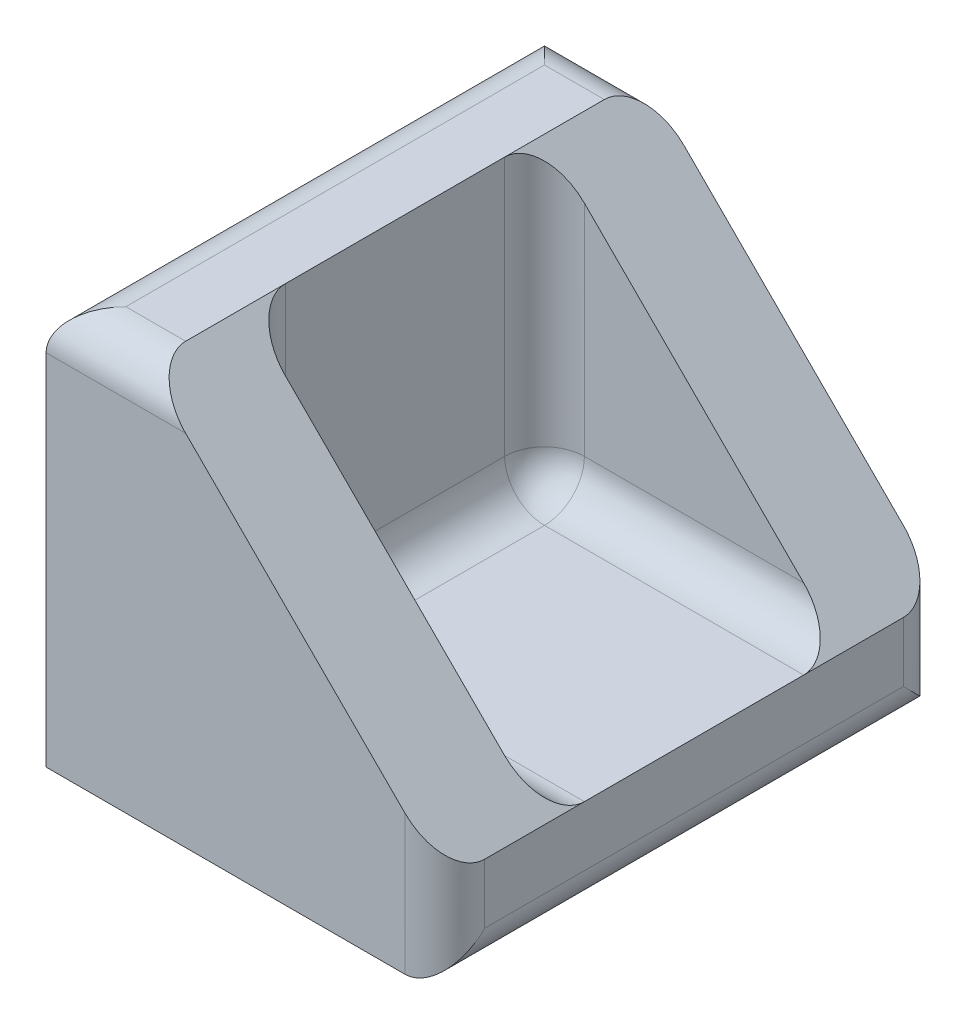
ISO-10303-21;
HEADER;
FILE_DESCRIPTION(('STEP AP214'),'2;1');
FILE_NAME('part.step','',(''),(''),'','','');
FILE_SCHEMA(('AUTOMOTIVE_DESIGN { 1 0 10303 214 1 1 1 1 }'));
ENDSEC;
DATA;
#1=APPLICATION_CONTEXT('core data for automotive mechanical design processes');
#2=APPLICATION_PROTOCOL_DEFINITION('international standard','automotive_design',2000,#1);
#3=PRODUCT_CONTEXT('',#1,'mechanical');
#4=PRODUCT('Part','Part','',(#3));
#5=PRODUCT_RELATED_PRODUCT_CATEGORY('part','',(#4));
#6=PRODUCT_DEFINITION_FORMATION('','',#4);
#7=PRODUCT_DEFINITION_CONTEXT('part definition',#1,'design');
#8=PRODUCT_DEFINITION('design','',#6,#7);
#9=PRODUCT_DEFINITION_SHAPE('','',#8);
#10=(LENGTH_UNIT() NAMED_UNIT(*) SI_UNIT(.MILLI.,.METRE.));
#11=(NAMED_UNIT(*) PLANE_ANGLE_UNIT() SI_UNIT($,.RADIAN.));
#12=(NAMED_UNIT(*) SI_UNIT($,.STERADIAN.) SOLID_ANGLE_UNIT());
#13=UNCERTAINTY_MEASURE_WITH_UNIT(LENGTH_MEASURE(1.E-05),#10,'distance_accuracy_value','');
#14=(GEOMETRIC_REPRESENTATION_CONTEXT(3) GLOBAL_UNCERTAINTY_ASSIGNED_CONTEXT((#13)) GLOBAL_UNIT_ASSIGNED_CONTEXT((#10,
#11,#12)) REPRESENTATION_CONTEXT('',''));
#15=CARTESIAN_POINT('',(0.,0.,0.));
#16=DIRECTION('',(0.,0.,1.));
#17=DIRECTION('',(1.,0.,0.));
#18=AXIS2_PLACEMENT_3D('',#15,#16,#17);
#19=CARTESIAN_POINT('',(5.,20.,-25.));
#20=DIRECTION('',(0.707106781186547,0.707106781186547,0.));
#21=DIRECTION('',(-0.707106781186548,0.707106781186548,0.));
#22=AXIS2_PLACEMENT_3D('',#19,#20,#21);
#23=PLANE('',#22);
#24=DIRECTION('',(-0.707106781186547,0.707106781186547,0.));
#25=VECTOR('',#24,1.);
#26=CARTESIAN_POINT('',(5.,20.,0.));
#27=LINE('',#26,#25);
#28=CARTESIAN_POINT('',(18.,7.,0.));
#29=VERTEX_POINT('',#28);
#30=CARTESIAN_POINT('',(7.,18.,0.));
#31=VERTEX_POINT('',#30);
#32=EDGE_CURVE('E184',#29,#31,#27,.T.);
#33=ORIENTED_EDGE('',*,*,#32,.F.);
#34=CARTESIAN_POINT('',(18.,7.,-2.));
#35=DIRECTION('',(0.707106781186547,0.707106781186547,0.));
#36=DIRECTION('',(0.707106781186548,-0.707106781186548,0.));
#37=AXIS2_PLACEMENT_3D('',#34,#35,#36);
#38=ELLIPSE('',#37,2.82842712474619,2.);
#39=CARTESIAN_POINT('',(20.,5.,-2.));
#40=VERTEX_POINT('',#39);
#41=EDGE_CURVE('E271',#29,#40,#38,.T.);
#42=ORIENTED_EDGE('',*,*,#41,.T.);
#43=DIRECTION('',(0.,0.,1.));
#44=VECTOR('',#43,1.);
#45=CARTESIAN_POINT('',(20.,5.,-25.));
#46=LINE('',#45,#44);
#47=CARTESIAN_POINT('',(20.,5.,-7.));
#48=VERTEX_POINT('',#47);
#49=EDGE_CURVE('E165',#48,#40,#46,.T.);
#50=ORIENTED_EDGE('',*,*,#49,.F.);
#51=CARTESIAN_POINT('',(18.,7.,-7.));
#52=DIRECTION('',(0.707106781186547,0.707106781186547,0.));
#53=DIRECTION('',(0.707106781186548,-0.707106781186548,0.));
#54=AXIS2_PLACEMENT_3D('',#51,#52,#53);
#55=ELLIPSE('',#54,2.82842712474619,2.);
#56=CARTESIAN_POINT('',(18.,7.,-5.));
#57=VERTEX_POINT('',#56);
#58=EDGE_CURVE('E226',#48,#57,#55,.F.);
#59=ORIENTED_EDGE('',*,*,#58,.T.);
#60=DIRECTION('',(-0.707106781186548,0.707106781186548,0.));
#61=VECTOR('',#60,1.);
#62=CARTESIAN_POINT('',(5.,20.,-5.));
#63=LINE('',#62,#61);
#64=CARTESIAN_POINT('',(7.,18.,-5.));
#65=VERTEX_POINT('',#64);
#66=EDGE_CURVE('E189',#57,#65,#63,.T.);
#67=ORIENTED_EDGE('',*,*,#66,.T.);
#68=CARTESIAN_POINT('',(7.,18.,-7.));
#69=DIRECTION('',(0.707106781186547,0.707106781186547,0.));
#70=DIRECTION('',(0.707106781186548,-0.707106781186548,0.));
#71=AXIS2_PLACEMENT_3D('',#68,#69,#70);
#72=ELLIPSE('',#71,2.82842712474619,2.);
#73=CARTESIAN_POINT('',(5.,20.,-7.));
#74=VERTEX_POINT('',#73);
#75=EDGE_CURVE('E221',#65,#74,#72,.F.);
#76=ORIENTED_EDGE('',*,*,#75,.T.);
#77=DIRECTION('',(0.,0.,1.));
#78=VECTOR('',#77,1.);
#79=CARTESIAN_POINT('',(5.,20.,-25.));
#80=LINE('',#79,#78);
#81=CARTESIAN_POINT('',(5.,20.,-2.));
#82=VERTEX_POINT('',#81);
#83=EDGE_CURVE('E193',#74,#82,#80,.T.);
#84=ORIENTED_EDGE('',*,*,#83,.T.);
#85=CARTESIAN_POINT('',(7.,18.,-2.));
#86=DIRECTION('',(0.707106781186547,0.707106781186547,0.));
#87=DIRECTION('',(0.707106781186548,-0.707106781186548,0.));
#88=AXIS2_PLACEMENT_3D('',#85,#86,#87);
#89=ELLIPSE('',#88,2.82842712474619,2.);
#90=EDGE_CURVE('E61',#82,#31,#89,.T.);
#91=ORIENTED_EDGE('',*,*,#90,.T.);
#92=EDGE_LOOP('',(#33,#42,#50,#59,#67,#76,#84,#91));
#93=FACE_BOUND('',#92,.T.);
#94=ADVANCED_FACE('F39',(#93),#23,.T.);
#95=CARTESIAN_POINT('',(20.,0.,-25.));
#96=DIRECTION('',(0.,-1.,0.));
#97=DIRECTION('',(0.,0.,-1.));
#98=AXIS2_PLACEMENT_3D('',#95,#96,#97);
#99=PLANE('',#98);
#100=DIRECTION('',(1.,0.,0.));
#101=VECTOR('',#100,1.);
#102=CARTESIAN_POINT('',(20.,0.,-25.));
#103=LINE('',#102,#101);
#104=CARTESIAN_POINT('',(0.,0.,-25.));
#105=VERTEX_POINT('',#104);
#106=CARTESIAN_POINT('',(18.,0.,-25.));
#107=VERTEX_POINT('',#106);
#108=EDGE_CURVE('E167',#105,#107,#103,.T.);
#109=ORIENTED_EDGE('',*,*,#108,.T.);
#110=DIRECTION('',(0.,0.,1.));
#111=VECTOR('',#110,1.);
#112=CARTESIAN_POINT('',(18.,0.,-25.));
#113=LINE('',#112,#111);
#114=CARTESIAN_POINT('',(18.,0.,0.));
#115=VERTEX_POINT('',#114);
#116=EDGE_CURVE('E48',#107,#115,#113,.T.);
#117=ORIENTED_EDGE('',*,*,#116,.T.);
#118=DIRECTION('',(1.,0.,0.));
#119=VECTOR('',#118,1.);
#120=CARTESIAN_POINT('',(20.,0.,0.));
#121=LINE('',#120,#119);
#122=CARTESIAN_POINT('',(0.,0.,0.));
#123=VERTEX_POINT('',#122);
#124=EDGE_CURVE('E173',#123,#115,#121,.T.);
#125=ORIENTED_EDGE('',*,*,#124,.F.);
#126=DIRECTION('',(0.,0.,1.));
#127=VECTOR('',#126,1.);
#128=CARTESIAN_POINT('',(0.,0.,-25.));
#129=LINE('',#128,#127);
#130=EDGE_CURVE('E158',#105,#123,#129,.T.);
#131=ORIENTED_EDGE('',*,*,#130,.F.);
#132=EDGE_LOOP('',(#109,#117,#125,#131));
#133=FACE_BOUND('',#132,.T.);
#134=ADVANCED_FACE('F169',(#133),#99,.T.);
#135=CARTESIAN_POINT('',(0.,0.,-25.));
#136=DIRECTION('',(-1.,0.,0.));
#137=DIRECTION('',(0.,0.,1.));
#138=AXIS2_PLACEMENT_3D('',#135,#136,#137);
#139=PLANE('',#138);
#140=DIRECTION('',(0.,-1.,0.));
#141=VECTOR('',#140,1.);
#142=CARTESIAN_POINT('',(0.,0.,0.));
#143=LINE('',#142,#141);
#144=CARTESIAN_POINT('',(0.,18.,0.));
#145=VERTEX_POINT('',#144);
#146=EDGE_CURVE('E181',#145,#123,#143,.T.);
#147=ORIENTED_EDGE('',*,*,#146,.F.);
#148=DIRECTION('',(0.,0.,1.));
#149=VECTOR('',#148,1.);
#150=CARTESIAN_POINT('',(0.,18.,-25.));
#151=LINE('',#150,#149);
#152=CARTESIAN_POINT('',(0.,18.,-25.));
#153=VERTEX_POINT('',#152);
#154=EDGE_CURVE('E11',#145,#153,#151,.F.);
#155=ORIENTED_EDGE('',*,*,#154,.T.);
#156=DIRECTION('',(0.,-1.,0.));
#157=VECTOR('',#156,1.);
#158=CARTESIAN_POINT('',(0.,0.,-25.));
#159=LINE('',#158,#157);
#160=EDGE_CURVE('E151',#153,#105,#159,.T.);
#161=ORIENTED_EDGE('',*,*,#160,.T.);
#162=ORIENTED_EDGE('',*,*,#130,.T.);
#163=EDGE_LOOP('',(#147,#155,#161,#162));
#164=FACE_BOUND('',#163,.T.);
#165=ADVANCED_FACE('F160',(#164),#139,.T.);
#166=CARTESIAN_POINT('',(0.,20.,-25.));
#167=DIRECTION('',(0.,1.,0.));
#168=DIRECTION('',(0.,0.,1.));
#169=AXIS2_PLACEMENT_3D('',#166,#167,#168);
#170=PLANE('',#169);
#171=CARTESIAN_POINT('',(5.,20.,-23.));
#172=VERTEX_POINT('',#171);
#173=CARTESIAN_POINT('',(5.,20.,-18.));
#174=VERTEX_POINT('',#173);
#175=EDGE_CURVE('E174',#172,#174,#80,.T.);
#176=ORIENTED_EDGE('',*,*,#175,.F.);
#177=DIRECTION('',(-1.,0.,0.));
#178=VECTOR('',#177,1.);
#179=CARTESIAN_POINT('',(0.,20.,-23.));
#180=LINE('',#179,#178);
#181=CARTESIAN_POINT('',(2.,20.,-23.));
#182=VERTEX_POINT('',#181);
#183=EDGE_CURVE('E255',#172,#182,#180,.T.);
#184=ORIENTED_EDGE('',*,*,#183,.T.);
#185=DIRECTION('',(0.,0.,1.));
#186=VECTOR('',#185,1.);
#187=CARTESIAN_POINT('',(2.,20.,-25.));
#188=LINE('',#187,#186);
#189=CARTESIAN_POINT('',(2.,20.,-2.));
#190=VERTEX_POINT('',#189);
#191=EDGE_CURVE('E229',#182,#190,#188,.T.);
#192=ORIENTED_EDGE('',*,*,#191,.T.);
#193=DIRECTION('',(-1.,0.,0.));
#194=VECTOR('',#193,1.);
#195=CARTESIAN_POINT('',(5.,20.,-2.));
#196=LINE('',#195,#194);
#197=EDGE_CURVE('E249',#190,#82,#196,.F.);
#198=ORIENTED_EDGE('',*,*,#197,.T.);
#199=ORIENTED_EDGE('',*,*,#83,.F.);
#200=DIRECTION('',(0.,0.,1.));
#201=VECTOR('',#200,1.);
#202=CARTESIAN_POINT('',(5.,20.,-25.));
#203=LINE('',#202,#201);
#204=EDGE_CURVE('E195',#174,#74,#203,.T.);
#205=ORIENTED_EDGE('',*,*,#204,.F.);
#206=EDGE_LOOP('',(#176,#184,#192,#198,#199,#205));
#207=FACE_BOUND('',#206,.T.);
#208=ADVANCED_FACE('F373',(#207),#170,.T.);
#209=DIRECTION('',(-0.707106781186547,0.707106781186547,0.));
#210=VECTOR('',#209,1.);
#211=CARTESIAN_POINT('',(5.,20.,-25.));
#212=LINE('',#211,#210);
#213=CARTESIAN_POINT('',(18.,7.,-25.));
#214=VERTEX_POINT('',#213);
#215=CARTESIAN_POINT('',(7.,18.,-25.));
#216=VERTEX_POINT('',#215);
#217=EDGE_CURVE('E164',#214,#216,#212,.T.);
#218=ORIENTED_EDGE('',*,*,#217,.T.);
#219=CARTESIAN_POINT('',(7.,18.,-23.));
#220=DIRECTION('',(0.707106781186547,0.707106781186547,0.));
#221=DIRECTION('',(-0.707106781186548,0.707106781186548,0.));
#222=AXIS2_PLACEMENT_3D('',#219,#220,#221);
#223=ELLIPSE('',#222,2.82842712474619,2.);
#224=EDGE_CURVE('E258',#216,#172,#223,.T.);
#225=ORIENTED_EDGE('',*,*,#224,.T.);
#226=ORIENTED_EDGE('',*,*,#175,.T.);
#227=CARTESIAN_POINT('',(7.,18.,-18.));
#228=DIRECTION('',(0.707106781186547,0.707106781186547,0.));
#229=DIRECTION('',(-0.707106781186548,0.707106781186548,0.));
#230=AXIS2_PLACEMENT_3D('',#227,#228,#229);
#231=ELLIPSE('',#230,2.82842712474619,2.);
#232=CARTESIAN_POINT('',(7.,18.,-20.));
#233=VERTEX_POINT('',#232);
#234=EDGE_CURVE('E216',#174,#233,#231,.F.);
#235=ORIENTED_EDGE('',*,*,#234,.T.);
#236=DIRECTION('',(-0.707106781186548,0.707106781186548,0.));
#237=VECTOR('',#236,1.);
#238=CARTESIAN_POINT('',(5.,20.,-20.));
#239=LINE('',#238,#237);
#240=CARTESIAN_POINT('',(18.,7.,-20.));
#241=VERTEX_POINT('',#240);
#242=EDGE_CURVE('E303',#241,#233,#239,.T.);
#243=ORIENTED_EDGE('',*,*,#242,.F.);
#244=CARTESIAN_POINT('',(18.,7.,-18.));
#245=DIRECTION('',(0.707106781186547,0.707106781186547,0.));
#246=DIRECTION('',(-0.707106781186548,0.707106781186548,0.));
#247=AXIS2_PLACEMENT_3D('',#244,#245,#246);
#248=ELLIPSE('',#247,2.82842712474619,2.);
#249=CARTESIAN_POINT('',(20.,5.,-18.));
#250=VERTEX_POINT('',#249);
#251=EDGE_CURVE('E225',#241,#250,#248,.F.);
#252=ORIENTED_EDGE('',*,*,#251,.T.);
#253=CARTESIAN_POINT('',(20.,5.,-23.));
#254=VERTEX_POINT('',#253);
#255=EDGE_CURVE('E197',#254,#250,#46,.T.);
#256=ORIENTED_EDGE('',*,*,#255,.F.);
#257=CARTESIAN_POINT('',(18.,7.,-23.));
#258=DIRECTION('',(0.707106781186547,0.707106781186547,0.));
#259=DIRECTION('',(-0.707106781186548,0.707106781186548,0.));
#260=AXIS2_PLACEMENT_3D('',#257,#258,#259);
#261=ELLIPSE('',#260,2.82842712474619,2.);
#262=EDGE_CURVE('E259',#254,#214,#261,.T.);
#263=ORIENTED_EDGE('',*,*,#262,.T.);
#264=EDGE_LOOP('',(#218,#225,#226,#235,#243,#252,#256,#263));
#265=FACE_BOUND('',#264,.T.);
#266=ADVANCED_FACE('F364',(#265),#23,.T.);
#267=CARTESIAN_POINT('',(20.,5.,-25.));
#268=DIRECTION('',(1.,0.,0.));
#269=DIRECTION('',(0.,0.,-1.));
#270=AXIS2_PLACEMENT_3D('',#267,#268,#269);
#271=PLANE('',#270);
#272=DIRECTION('',(0.,0.,1.));
#273=VECTOR('',#272,1.);
#274=CARTESIAN_POINT('',(20.,2.,-25.));
#275=LINE('',#274,#273);
#276=CARTESIAN_POINT('',(20.,2.,-2.));
#277=VERTEX_POINT('',#276);
#278=CARTESIAN_POINT('',(20.,2.,-23.));
#279=VERTEX_POINT('',#278);
#280=EDGE_CURVE('E265',#277,#279,#275,.F.);
#281=ORIENTED_EDGE('',*,*,#280,.T.);
#282=DIRECTION('',(0.,1.,0.));
#283=VECTOR('',#282,1.);
#284=CARTESIAN_POINT('',(20.,5.,-23.));
#285=LINE('',#284,#283);
#286=EDGE_CURVE('E267',#279,#254,#285,.T.);
#287=ORIENTED_EDGE('',*,*,#286,.T.);
#288=ORIENTED_EDGE('',*,*,#255,.T.);
#289=DIRECTION('',(0.,0.,1.));
#290=VECTOR('',#289,1.);
#291=CARTESIAN_POINT('',(20.,5.,-25.));
#292=LINE('',#291,#290);
#293=EDGE_CURVE('E299',#250,#48,#292,.T.);
#294=ORIENTED_EDGE('',*,*,#293,.T.);
#295=ORIENTED_EDGE('',*,*,#49,.T.);
#296=DIRECTION('',(0.,1.,0.));
#297=VECTOR('',#296,1.);
#298=CARTESIAN_POINT('',(20.,0.,-2.));
#299=LINE('',#298,#297);
#300=EDGE_CURVE('E264',#40,#277,#299,.F.);
#301=ORIENTED_EDGE('',*,*,#300,.T.);
#302=EDGE_LOOP('',(#281,#287,#288,#294,#295,#301));
#303=FACE_BOUND('',#302,.T.);
#304=ADVANCED_FACE('F300',(#303),#271,.T.);
#305=CARTESIAN_POINT('',(0.,0.,-25.));
#306=DIRECTION('',(0.,0.,-1.));
#307=DIRECTION('',(-1.,0.,0.));
#308=AXIS2_PLACEMENT_3D('',#305,#306,#307);
#309=PLANE('',#308);
#310=ORIENTED_EDGE('',*,*,#160,.F.);
#311=DIRECTION('',(-1.,0.,0.));
#312=VECTOR('',#311,1.);
#313=CARTESIAN_POINT('',(0.,18.,-25.));
#314=LINE('',#313,#312);
#315=EDGE_CURVE('E257',#153,#216,#314,.F.);
#316=ORIENTED_EDGE('',*,*,#315,.T.);
#317=ORIENTED_EDGE('',*,*,#217,.F.);
#318=DIRECTION('',(0.,1.,0.));
#319=VECTOR('',#318,1.);
#320=CARTESIAN_POINT('',(18.,0.,-25.));
#321=LINE('',#320,#319);
#322=EDGE_CURVE('E179',#214,#107,#321,.F.);
#323=ORIENTED_EDGE('',*,*,#322,.T.);
#324=ORIENTED_EDGE('',*,*,#108,.F.);
#325=EDGE_LOOP('',(#310,#316,#317,#323,#324));
#326=FACE_BOUND('',#325,.T.);
#327=ADVANCED_FACE('F180',(#326),#309,.T.);
#328=CARTESIAN_POINT('',(0.,0.,0.));
#329=DIRECTION('',(0.,0.,-1.));
#330=DIRECTION('',(-1.,0.,0.));
#331=AXIS2_PLACEMENT_3D('',#328,#329,#330);
#332=PLANE('',#331);
#333=ORIENTED_EDGE('',*,*,#124,.T.);
#334=DIRECTION('',(0.,1.,0.));
#335=VECTOR('',#334,1.);
#336=CARTESIAN_POINT('',(18.,5.,0.));
#337=LINE('',#336,#335);
#338=EDGE_CURVE('E266',#115,#29,#337,.T.);
#339=ORIENTED_EDGE('',*,*,#338,.T.);
#340=ORIENTED_EDGE('',*,*,#32,.T.);
#341=DIRECTION('',(-1.,0.,0.));
#342=VECTOR('',#341,1.);
#343=CARTESIAN_POINT('',(0.,18.,0.));
#344=LINE('',#343,#342);
#345=EDGE_CURVE('E57',#31,#145,#344,.T.);
#346=ORIENTED_EDGE('',*,*,#345,.T.);
#347=ORIENTED_EDGE('',*,*,#146,.T.);
#348=EDGE_LOOP('',(#333,#339,#340,#346,#347));
#349=FACE_BOUND('',#348,.T.);
#350=ADVANCED_FACE('F291',(#349),#332,.F.);
#351=CARTESIAN_POINT('',(20.,5.,-25.));
#352=DIRECTION('',(0.,-1.,0.));
#353=DIRECTION('',(0.,0.,-1.));
#354=AXIS2_PLACEMENT_3D('',#351,#352,#353);
#355=PLANE('',#354);
#356=ORIENTED_EDGE('',*,*,#293,.F.);
#357=DIRECTION('',(1.,0.,0.));
#358=VECTOR('',#357,1.);
#359=CARTESIAN_POINT('',(5.,5.,-18.));
#360=LINE('',#359,#358);
#361=CARTESIAN_POINT('',(7.,5.,-18.));
#362=VERTEX_POINT('',#361);
#363=EDGE_CURVE('E211',#250,#362,#360,.F.);
#364=ORIENTED_EDGE('',*,*,#363,.T.);
#365=DIRECTION('',(0.,0.,1.));
#366=VECTOR('',#365,1.);
#367=CARTESIAN_POINT('',(7.,5.,-5.));
#368=LINE('',#367,#366);
#369=CARTESIAN_POINT('',(7.,5.,-7.));
#370=VERTEX_POINT('',#369);
#371=EDGE_CURVE('E209',#362,#370,#368,.T.);
#372=ORIENTED_EDGE('',*,*,#371,.T.);
#373=DIRECTION('',(1.,0.,0.));
#374=VECTOR('',#373,1.);
#375=CARTESIAN_POINT('',(20.,5.,-7.));
#376=LINE('',#375,#374);
#377=EDGE_CURVE('E212',#370,#48,#376,.T.);
#378=ORIENTED_EDGE('',*,*,#377,.T.);
#379=EDGE_LOOP('',(#356,#364,#372,#378));
#380=FACE_BOUND('',#379,.T.);
#381=ADVANCED_FACE('F359',(#380),#355,.F.);
#382=CARTESIAN_POINT('',(5.,0.,-25.));
#383=DIRECTION('',(-1.,0.,0.));
#384=DIRECTION('',(0.,0.,1.));
#385=AXIS2_PLACEMENT_3D('',#382,#383,#384);
#386=PLANE('',#385);
#387=DIRECTION('',(0.,0.,1.));
#388=VECTOR('',#387,1.);
#389=CARTESIAN_POINT('',(5.,7.,-20.));
#390=LINE('',#389,#388);
#391=CARTESIAN_POINT('',(5.,7.,-7.));
#392=VERTEX_POINT('',#391);
#393=CARTESIAN_POINT('',(5.,7.,-18.));
#394=VERTEX_POINT('',#393);
#395=EDGE_CURVE('E205',#392,#394,#390,.F.);
#396=ORIENTED_EDGE('',*,*,#395,.T.);
#397=DIRECTION('',(0.,-1.,0.));
#398=VECTOR('',#397,1.);
#399=CARTESIAN_POINT('',(5.,20.,-18.));
#400=LINE('',#399,#398);
#401=EDGE_CURVE('E207',#394,#174,#400,.F.);
#402=ORIENTED_EDGE('',*,*,#401,.T.);
#403=ORIENTED_EDGE('',*,*,#204,.T.);
#404=DIRECTION('',(0.,-1.,0.));
#405=VECTOR('',#404,1.);
#406=CARTESIAN_POINT('',(5.,0.,-7.));
#407=LINE('',#406,#405);
#408=EDGE_CURVE('E204',#74,#392,#407,.T.);
#409=ORIENTED_EDGE('',*,*,#408,.T.);
#410=EDGE_LOOP('',(#396,#402,#403,#409));
#411=FACE_BOUND('',#410,.T.);
#412=ADVANCED_FACE('F321',(#411),#386,.F.);
#413=CARTESIAN_POINT('',(0.,0.,-20.));
#414=DIRECTION('',(0.,0.,-1.));
#415=DIRECTION('',(-1.,0.,0.));
#416=AXIS2_PLACEMENT_3D('',#413,#414,#415);
#417=PLANE('',#416);
#418=ORIENTED_EDGE('',*,*,#242,.T.);
#419=DIRECTION('',(0.,-1.,0.));
#420=VECTOR('',#419,1.);
#421=CARTESIAN_POINT('',(7.,5.,-20.));
#422=LINE('',#421,#420);
#423=CARTESIAN_POINT('',(7.,7.,-20.));
#424=VERTEX_POINT('',#423);
#425=EDGE_CURVE('E199',#233,#424,#422,.T.);
#426=ORIENTED_EDGE('',*,*,#425,.T.);
#427=DIRECTION('',(1.,0.,0.));
#428=VECTOR('',#427,1.);
#429=CARTESIAN_POINT('',(20.,7.,-20.));
#430=LINE('',#429,#428);
#431=EDGE_CURVE('E172',#424,#241,#430,.T.);
#432=ORIENTED_EDGE('',*,*,#431,.T.);
#433=EDGE_LOOP('',(#418,#426,#432));
#434=FACE_BOUND('',#433,.T.);
#435=ADVANCED_FACE('F355',(#434),#417,.F.);
#436=CARTESIAN_POINT('',(0.,0.,-5.));
#437=DIRECTION('',(0.,0.,-1.));
#438=DIRECTION('',(-1.,0.,0.));
#439=AXIS2_PLACEMENT_3D('',#436,#437,#438);
#440=PLANE('',#439);
#441=DIRECTION('',(1.,0.,0.));
#442=VECTOR('',#441,1.);
#443=CARTESIAN_POINT('',(0.,7.,-5.));
#444=LINE('',#443,#442);
#445=CARTESIAN_POINT('',(7.,7.,-5.));
#446=VERTEX_POINT('',#445);
#447=EDGE_CURVE('E217',#57,#446,#444,.F.);
#448=ORIENTED_EDGE('',*,*,#447,.T.);
#449=DIRECTION('',(0.,-1.,0.));
#450=VECTOR('',#449,1.);
#451=CARTESIAN_POINT('',(7.,0.,-5.));
#452=LINE('',#451,#450);
#453=EDGE_CURVE('E218',#446,#65,#452,.F.);
#454=ORIENTED_EDGE('',*,*,#453,.T.);
#455=ORIENTED_EDGE('',*,*,#66,.F.);
#456=EDGE_LOOP('',(#448,#454,#455));
#457=FACE_BOUND('',#456,.T.);
#458=ADVANCED_FACE('F313',(#457),#440,.T.);
#459=CARTESIAN_POINT('',(20.,7.,-7.));
#460=DIRECTION('',(1.,0.,0.));
#461=DIRECTION('',(0.,0.,-1.));
#462=AXIS2_PLACEMENT_3D('',#459,#460,#461);
#463=CYLINDRICAL_SURFACE('',#462,2.);
#464=ORIENTED_EDGE('',*,*,#58,.F.);
#465=ORIENTED_EDGE('',*,*,#377,.F.);
#466=CARTESIAN_POINT('',(7.,7.,-7.));
#467=DIRECTION('',(1.,0.,0.));
#468=DIRECTION('',(0.,1.,0.));
#469=AXIS2_PLACEMENT_3D('',#466,#467,#468);
#470=CIRCLE('',#469,2.);
#471=EDGE_CURVE('E246',#446,#370,#470,.T.);
#472=ORIENTED_EDGE('',*,*,#471,.F.);
#473=ORIENTED_EDGE('',*,*,#447,.F.);
#474=EDGE_LOOP('',(#464,#465,#472,#473));
#475=FACE_BOUND('',#474,.T.);
#476=ADVANCED_FACE('F308',(#475),#463,.F.);
#477=CARTESIAN_POINT('',(7.,0.,-7.));
#478=DIRECTION('',(0.,-1.,0.));
#479=DIRECTION('',(0.,0.,-1.));
#480=AXIS2_PLACEMENT_3D('',#477,#478,#479);
#481=CYLINDRICAL_SURFACE('',#480,2.);
#482=ORIENTED_EDGE('',*,*,#75,.F.);
#483=ORIENTED_EDGE('',*,*,#453,.F.);
#484=CARTESIAN_POINT('',(7.,7.,-7.));
#485=DIRECTION('',(0.,1.,0.));
#486=DIRECTION('',(0.,0.,1.));
#487=AXIS2_PLACEMENT_3D('',#484,#485,#486);
#488=CIRCLE('',#487,2.);
#489=EDGE_CURVE('E243',#392,#446,#488,.T.);
#490=ORIENTED_EDGE('',*,*,#489,.F.);
#491=ORIENTED_EDGE('',*,*,#408,.F.);
#492=EDGE_LOOP('',(#482,#483,#490,#491));
#493=FACE_BOUND('',#492,.T.);
#494=ADVANCED_FACE('F335',(#493),#481,.F.);
#495=CARTESIAN_POINT('',(7.,7.,-7.));
#496=DIRECTION('',(0.,0.,1.));
#497=DIRECTION('',(1.,0.,0.));
#498=AXIS2_PLACEMENT_3D('',#495,#496,#497);
#499=SPHERICAL_SURFACE('',#498,2.);
#500=ORIENTED_EDGE('',*,*,#489,.T.);
#501=ORIENTED_EDGE('',*,*,#471,.T.);
#502=CARTESIAN_POINT('',(7.,7.,-7.));
#503=DIRECTION('',(0.,0.,-1.));
#504=DIRECTION('',(-1.,0.,0.));
#505=AXIS2_PLACEMENT_3D('',#502,#503,#504);
#506=CIRCLE('',#505,2.);
#507=EDGE_CURVE('E239',#392,#370,#506,.F.);
#508=ORIENTED_EDGE('',*,*,#507,.F.);
#509=EDGE_LOOP('',(#500,#501,#508));
#510=FACE_BOUND('',#509,.T.);
#511=ADVANCED_FACE('F337',(#510),#499,.F.);
#512=CARTESIAN_POINT('',(0.,7.,-18.));
#513=DIRECTION('',(-1.,0.,0.));
#514=DIRECTION('',(0.,0.,1.));
#515=AXIS2_PLACEMENT_3D('',#512,#513,#514);
#516=CYLINDRICAL_SURFACE('',#515,2.);
#517=ORIENTED_EDGE('',*,*,#251,.F.);
#518=ORIENTED_EDGE('',*,*,#431,.F.);
#519=CARTESIAN_POINT('',(7.,7.,-18.));
#520=DIRECTION('',(1.,0.,0.));
#521=DIRECTION('',(0.,0.,-1.));
#522=AXIS2_PLACEMENT_3D('',#519,#520,#521);
#523=CIRCLE('',#522,2.);
#524=EDGE_CURVE('E240',#362,#424,#523,.T.);
#525=ORIENTED_EDGE('',*,*,#524,.F.);
#526=ORIENTED_EDGE('',*,*,#363,.F.);
#527=EDGE_LOOP('',(#517,#518,#525,#526));
#528=FACE_BOUND('',#527,.T.);
#529=ADVANCED_FACE('F352',(#528),#516,.F.);
#530=CARTESIAN_POINT('',(7.,7.,-25.));
#531=DIRECTION('',(0.,0.,-1.));
#532=DIRECTION('',(-1.,0.,0.));
#533=AXIS2_PLACEMENT_3D('',#530,#531,#532);
#534=CYLINDRICAL_SURFACE('',#533,2.);
#535=ORIENTED_EDGE('',*,*,#507,.T.);
#536=ORIENTED_EDGE('',*,*,#371,.F.);
#537=CARTESIAN_POINT('',(7.,7.,-18.));
#538=DIRECTION('',(0.,0.,1.));
#539=DIRECTION('',(1.,0.,0.));
#540=AXIS2_PLACEMENT_3D('',#537,#538,#539);
#541=CIRCLE('',#540,2.);
#542=EDGE_CURVE('E231',#394,#362,#541,.T.);
#543=ORIENTED_EDGE('',*,*,#542,.F.);
#544=ORIENTED_EDGE('',*,*,#395,.F.);
#545=EDGE_LOOP('',(#535,#536,#543,#544));
#546=FACE_BOUND('',#545,.T.);
#547=ADVANCED_FACE('F338',(#546),#534,.F.);
#548=CARTESIAN_POINT('',(7.,7.,-18.));
#549=DIRECTION('',(0.,-1.,0.));
#550=DIRECTION('',(1.,0.,0.));
#551=AXIS2_PLACEMENT_3D('',#548,#549,#550);
#552=SPHERICAL_SURFACE('',#551,2.);
#553=ORIENTED_EDGE('',*,*,#542,.T.);
#554=ORIENTED_EDGE('',*,*,#524,.T.);
#555=CARTESIAN_POINT('',(7.,7.,-18.));
#556=DIRECTION('',(0.,1.,0.));
#557=DIRECTION('',(0.,0.,1.));
#558=AXIS2_PLACEMENT_3D('',#555,#556,#557);
#559=CIRCLE('',#558,2.);
#560=EDGE_CURVE('E233',#394,#424,#559,.F.);
#561=ORIENTED_EDGE('',*,*,#560,.F.);
#562=EDGE_LOOP('',(#553,#554,#561));
#563=FACE_BOUND('',#562,.T.);
#564=ADVANCED_FACE('F347',(#563),#552,.F.);
#565=CARTESIAN_POINT('',(7.,0.,-18.));
#566=DIRECTION('',(0.,1.,0.));
#567=DIRECTION('',(0.,0.,1.));
#568=AXIS2_PLACEMENT_3D('',#565,#566,#567);
#569=CYLINDRICAL_SURFACE('',#568,2.);
#570=ORIENTED_EDGE('',*,*,#234,.F.);
#571=ORIENTED_EDGE('',*,*,#401,.F.);
#572=ORIENTED_EDGE('',*,*,#560,.T.);
#573=ORIENTED_EDGE('',*,*,#425,.F.);
#574=EDGE_LOOP('',(#570,#571,#572,#573));
#575=FACE_BOUND('',#574,.T.);
#576=ADVANCED_FACE('F343',(#575),#569,.F.);
#577=CARTESIAN_POINT('',(0.,18.,-2.));
#578=DIRECTION('',(1.,0.,0.));
#579=DIRECTION('',(0.,0.,-1.));
#580=AXIS2_PLACEMENT_3D('',#577,#578,#579);
#581=CYLINDRICAL_SURFACE('',#580,2.);
#582=ORIENTED_EDGE('',*,*,#90,.F.);
#583=ORIENTED_EDGE('',*,*,#197,.F.);
#584=CARTESIAN_POINT('',(2.,18.,-2.));
#585=DIRECTION('',(0.707106781186547,0.,0.707106781186547));
#586=DIRECTION('',(-0.707106781186547,0.,0.707106781186547));
#587=AXIS2_PLACEMENT_3D('',#584,#585,#586);
#588=ELLIPSE('',#587,2.82842712474619,2.);
#589=EDGE_CURVE('E234',#145,#190,#588,.F.);
#590=ORIENTED_EDGE('',*,*,#589,.F.);
#591=ORIENTED_EDGE('',*,*,#345,.F.);
#592=EDGE_LOOP('',(#582,#583,#590,#591));
#593=FACE_BOUND('',#592,.T.);
#594=ADVANCED_FACE('F508',(#593),#581,.T.);
#595=CARTESIAN_POINT('',(2.,18.,-25.));
#596=DIRECTION('',(0.,0.,1.));
#597=DIRECTION('',(1.,0.,0.));
#598=AXIS2_PLACEMENT_3D('',#595,#596,#597);
#599=CYLINDRICAL_SURFACE('',#598,2.);
#600=ORIENTED_EDGE('',*,*,#589,.T.);
#601=ORIENTED_EDGE('',*,*,#191,.F.);
#602=CARTESIAN_POINT('',(2.,18.,-23.));
#603=DIRECTION('',(-0.707106781186547,0.,0.707106781186547));
#604=DIRECTION('',(0.707106781186547,0.,0.707106781186547));
#605=AXIS2_PLACEMENT_3D('',#602,#603,#604);
#606=ELLIPSE('',#605,2.82842712474619,2.);
#607=EDGE_CURVE('E277',#153,#182,#606,.F.);
#608=ORIENTED_EDGE('',*,*,#607,.F.);
#609=ORIENTED_EDGE('',*,*,#154,.F.);
#610=EDGE_LOOP('',(#600,#601,#608,#609));
#611=FACE_BOUND('',#610,.T.);
#612=ADVANCED_FACE('F520',(#611),#599,.T.);
#613=CARTESIAN_POINT('',(0.,18.,-23.));
#614=DIRECTION('',(-1.,0.,0.));
#615=DIRECTION('',(0.,0.,1.));
#616=AXIS2_PLACEMENT_3D('',#613,#614,#615);
#617=CYLINDRICAL_SURFACE('',#616,2.);
#618=ORIENTED_EDGE('',*,*,#224,.F.);
#619=ORIENTED_EDGE('',*,*,#315,.F.);
#620=ORIENTED_EDGE('',*,*,#607,.T.);
#621=ORIENTED_EDGE('',*,*,#183,.F.);
#622=EDGE_LOOP('',(#618,#619,#620,#621));
#623=FACE_BOUND('',#622,.T.);
#624=ADVANCED_FACE('F385',(#623),#617,.T.);
#625=CARTESIAN_POINT('',(18.,0.,-2.));
#626=DIRECTION('',(0.,-1.,0.));
#627=DIRECTION('',(0.,0.,-1.));
#628=AXIS2_PLACEMENT_3D('',#625,#626,#627);
#629=CYLINDRICAL_SURFACE('',#628,2.);
#630=ORIENTED_EDGE('',*,*,#41,.F.);
#631=ORIENTED_EDGE('',*,*,#338,.F.);
#632=CARTESIAN_POINT('',(18.,2.,-2.));
#633=DIRECTION('',(0.,0.707106781186547,0.707106781186547));
#634=DIRECTION('',(0.,-0.707106781186547,0.707106781186547));
#635=AXIS2_PLACEMENT_3D('',#632,#633,#634);
#636=ELLIPSE('',#635,2.82842712474619,2.);
#637=EDGE_CURVE('E43',#277,#115,#636,.F.);
#638=ORIENTED_EDGE('',*,*,#637,.F.);
#639=ORIENTED_EDGE('',*,*,#300,.F.);
#640=EDGE_LOOP('',(#630,#631,#638,#639));
#641=FACE_BOUND('',#640,.T.);
#642=ADVANCED_FACE('F41',(#641),#629,.T.);
#643=CARTESIAN_POINT('',(18.,2.,-25.));
#644=DIRECTION('',(0.,0.,1.));
#645=DIRECTION('',(1.,0.,0.));
#646=AXIS2_PLACEMENT_3D('',#643,#644,#645);
#647=CYLINDRICAL_SURFACE('',#646,2.);
#648=ORIENTED_EDGE('',*,*,#637,.T.);
#649=ORIENTED_EDGE('',*,*,#116,.F.);
#650=CARTESIAN_POINT('',(18.,2.,-23.));
#651=DIRECTION('',(0.,-0.707106781186547,0.707106781186547));
#652=DIRECTION('',(0.,0.707106781186547,0.707106781186547));
#653=AXIS2_PLACEMENT_3D('',#650,#651,#652);
#654=ELLIPSE('',#653,2.82842712474619,2.);
#655=EDGE_CURVE('E276',#279,#107,#654,.F.);
#656=ORIENTED_EDGE('',*,*,#655,.F.);
#657=ORIENTED_EDGE('',*,*,#280,.F.);
#658=EDGE_LOOP('',(#648,#649,#656,#657));
#659=FACE_BOUND('',#658,.T.);
#660=ADVANCED_FACE('F288',(#659),#647,.T.);
#661=CARTESIAN_POINT('',(18.,5.,-23.));
#662=DIRECTION('',(0.,1.,0.));
#663=DIRECTION('',(0.,0.,1.));
#664=AXIS2_PLACEMENT_3D('',#661,#662,#663);
#665=CYLINDRICAL_SURFACE('',#664,2.);
#666=ORIENTED_EDGE('',*,*,#655,.T.);
#667=ORIENTED_EDGE('',*,*,#322,.F.);
#668=ORIENTED_EDGE('',*,*,#262,.F.);
#669=ORIENTED_EDGE('',*,*,#286,.F.);
#670=EDGE_LOOP('',(#666,#667,#668,#669));
#671=FACE_BOUND('',#670,.T.);
#672=ADVANCED_FACE('F553',(#671),#665,.T.);
#673=CLOSED_SHELL('',(#94,#134,#165,#208,#266,#304,#327,#350,#381,#412,#435,#458,#476,#494,#511,
#529,#547,#564,#576,#594,#612,#624,#642,#660,#672));
#674=MANIFOLD_SOLID_BREP('B2',#673);
#675=ADVANCED_BREP_SHAPE_REPRESENTATION('',(#18,#674),#14);
#676=SHAPE_DEFINITION_REPRESENTATION(#9,#675);
ENDSEC;
END-ISO-10303-21;
